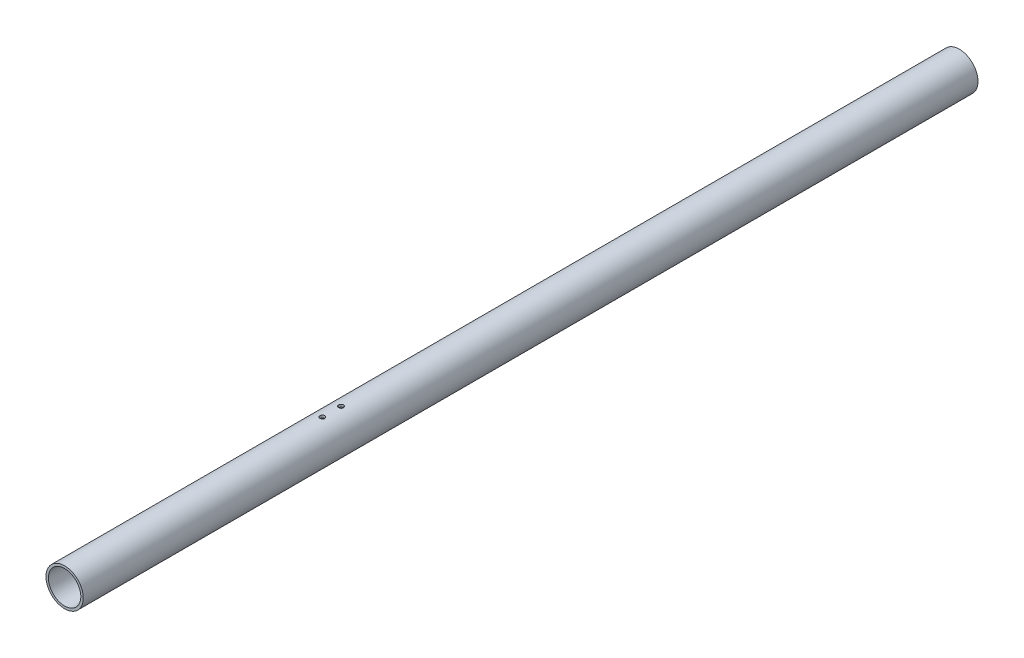
ISO-10303-21;
HEADER;
FILE_DESCRIPTION(('STEP AP214'),'2;1');
FILE_NAME('part.step','',(''),(''),'','','');
FILE_SCHEMA(('AUTOMOTIVE_DESIGN { 1 0 10303 214 1 1 1 1 }'));
ENDSEC;
DATA;
#1=APPLICATION_CONTEXT('core data for automotive mechanical design processes');
#2=APPLICATION_PROTOCOL_DEFINITION('international standard','automotive_design',2000,#1);
#3=PRODUCT_CONTEXT('',#1,'mechanical');
#4=PRODUCT('Part','Part','',(#3));
#5=PRODUCT_RELATED_PRODUCT_CATEGORY('part','',(#4));
#6=PRODUCT_DEFINITION_FORMATION('','',#4);
#7=PRODUCT_DEFINITION_CONTEXT('part definition',#1,'design');
#8=PRODUCT_DEFINITION('design','',#6,#7);
#9=PRODUCT_DEFINITION_SHAPE('','',#8);
#10=(LENGTH_UNIT() NAMED_UNIT(*) SI_UNIT(.MILLI.,.METRE.));
#11=(NAMED_UNIT(*) PLANE_ANGLE_UNIT() SI_UNIT($,.RADIAN.));
#12=(NAMED_UNIT(*) SI_UNIT($,.STERADIAN.) SOLID_ANGLE_UNIT());
#13=UNCERTAINTY_MEASURE_WITH_UNIT(LENGTH_MEASURE(1.E-05),#10,'distance_accuracy_value','');
#14=(GEOMETRIC_REPRESENTATION_CONTEXT(3) GLOBAL_UNCERTAINTY_ASSIGNED_CONTEXT((#13)) GLOBAL_UNIT_ASSIGNED_CONTEXT((#10,
#11,#12)) REPRESENTATION_CONTEXT('',''));
#15=CARTESIAN_POINT('',(0.,0.,0.));
#16=DIRECTION('',(0.,0.,1.));
#17=DIRECTION('',(1.,0.,0.));
#18=AXIS2_PLACEMENT_3D('',#15,#16,#17);
#19=CARTESIAN_POINT('',(0.,0.,0.));
#20=DIRECTION('',(0.,0.,1.));
#21=DIRECTION('',(1.,0.,0.));
#22=AXIS2_PLACEMENT_3D('',#19,#20,#21);
#23=PLANE('',#22);
#24=CARTESIAN_POINT('',(0.,0.,0.));
#25=DIRECTION('',(0.,0.,1.));
#26=DIRECTION('',(1.,0.,0.));
#27=AXIS2_PLACEMENT_3D('',#24,#25,#26);
#28=CIRCLE('',#27,12.7);
#29=CARTESIAN_POINT('',(12.7,0.,0.));
#30=VERTEX_POINT('',#29);
#31=EDGE_CURVE('E37',#30,#30,#28,.T.);
#32=ORIENTED_EDGE('',*,*,#31,.F.);
#33=EDGE_LOOP('',(#32));
#34=FACE_BOUND('',#33,.T.);
#35=CARTESIAN_POINT('',(0.,0.,0.));
#36=DIRECTION('',(0.,0.,1.));
#37=DIRECTION('',(1.,0.,0.));
#38=AXIS2_PLACEMENT_3D('',#35,#36,#37);
#39=CIRCLE('',#38,11.0998);
#40=CARTESIAN_POINT('',(-11.0998,0.,0.));
#41=VERTEX_POINT('',#40);
#42=EDGE_CURVE('E183',#41,#41,#39,.T.);
#43=ORIENTED_EDGE('',*,*,#42,.T.);
#44=EDGE_LOOP('',(#43));
#45=FACE_BOUND('',#44,.T.);
#46=ADVANCED_FACE('F33',(#34,#45),#23,.F.);
#47=CARTESIAN_POINT('',(0.,0.,609.6));
#48=DIRECTION('',(0.,0.,1.));
#49=DIRECTION('',(1.,0.,0.));
#50=AXIS2_PLACEMENT_3D('',#47,#48,#49);
#51=PLANE('',#50);
#52=CARTESIAN_POINT('',(0.,0.,609.6));
#53=DIRECTION('',(0.,0.,1.));
#54=DIRECTION('',(1.,0.,0.));
#55=AXIS2_PLACEMENT_3D('',#52,#53,#54);
#56=CIRCLE('',#55,12.7);
#57=CARTESIAN_POINT('',(12.7,0.,609.6));
#58=VERTEX_POINT('',#57);
#59=EDGE_CURVE('E11',#58,#58,#56,.T.);
#60=ORIENTED_EDGE('',*,*,#59,.T.);
#61=EDGE_LOOP('',(#60));
#62=FACE_BOUND('',#61,.T.);
#63=CARTESIAN_POINT('',(0.,0.,609.6));
#64=DIRECTION('',(0.,0.,1.));
#65=DIRECTION('',(1.,0.,0.));
#66=AXIS2_PLACEMENT_3D('',#63,#64,#65);
#67=CIRCLE('',#66,11.049);
#68=CARTESIAN_POINT('',(11.049,0.,609.6));
#69=VERTEX_POINT('',#68);
#70=EDGE_CURVE('E187',#69,#69,#67,.T.);
#71=ORIENTED_EDGE('',*,*,#70,.F.);
#72=EDGE_LOOP('',(#71));
#73=FACE_BOUND('',#72,.T.);
#74=ADVANCED_FACE('F141',(#62,#73),#51,.T.);
#75=CARTESIAN_POINT('',(0.,0.,609.6));
#76=DIRECTION('',(0.,0.,-1.));
#77=DIRECTION('',(-1.,0.,0.));
#78=AXIS2_PLACEMENT_3D('',#75,#76,#77);
#79=CYLINDRICAL_SURFACE('',#78,12.7);
#80=CARTESIAN_POINT('',(0.,0.,228.6));
#81=DIRECTION('',(0.,0.,-1.));
#82=DIRECTION('',(-1.,0.,0.));
#83=AXIS2_PLACEMENT_3D('',#80,#81,#82);
#84=CIRCLE('',#83,12.7);
#85=CARTESIAN_POINT('',(-7.62,-10.16,228.6));
#86=VERTEX_POINT('',#85);
#87=CARTESIAN_POINT('',(7.62,-10.16,228.6));
#88=VERTEX_POINT('',#87);
#89=EDGE_CURVE('E92',#86,#88,#84,.F.);
#90=ORIENTED_EDGE('',*,*,#89,.F.);
#91=DIRECTION('',(0.,0.,-1.));
#92=VECTOR('',#91,1.);
#93=CARTESIAN_POINT('',(-7.6200000000004,-10.1599999999997,609.6));
#94=LINE('',#93,#92);
#95=CARTESIAN_POINT('',(-7.62000000000007,-10.1599999999999,292.1));
#96=VERTEX_POINT('',#95);
#97=EDGE_CURVE('E48',#96,#86,#94,.T.);
#98=ORIENTED_EDGE('',*,*,#97,.F.);
#99=CARTESIAN_POINT('',(0.,0.,292.1));
#100=DIRECTION('',(0.,0.,1.));
#101=DIRECTION('',(1.,0.,0.));
#102=AXIS2_PLACEMENT_3D('',#99,#100,#101);
#103=CIRCLE('',#102,12.7);
#104=CARTESIAN_POINT('',(7.62,-10.16,292.1));
#105=VERTEX_POINT('',#104);
#106=EDGE_CURVE('E84',#105,#96,#103,.F.);
#107=ORIENTED_EDGE('',*,*,#106,.F.);
#108=DIRECTION('',(0.,0.,-1.));
#109=VECTOR('',#108,1.);
#110=CARTESIAN_POINT('',(7.62,-10.16,609.6));
#111=LINE('',#110,#109);
#112=EDGE_CURVE('E91',#88,#105,#111,.F.);
#113=ORIENTED_EDGE('',*,*,#112,.F.);
#114=EDGE_LOOP('',(#90,#98,#107,#113));
#115=FACE_BOUND('',#114,.T.);
#116=CARTESIAN_POINT('',(0.,12.7,422.9735));
#117=CARTESIAN_POINT('',(0.0923197389102192,12.699998670555,422.973496097362));
#118=CARTESIAN_POINT('',(0.184696404283785,12.6989827379539,422.965730456101));
#119=CARTESIAN_POINT('',(0.366877064574824,12.6950277124567,422.934875591195));
#120=CARTESIAN_POINT('',(0.456678307147007,12.69208663666,422.911770567612));
#121=CARTESIAN_POINT('',(0.631044478997818,12.6846125013601,422.850931013443));
#122=CARTESIAN_POINT('',(0.71561296750879,12.6800805382702,422.813206556474));
#123=CARTESIAN_POINT('',(0.877203333005435,12.6699280658685,422.724221529481));
#124=CARTESIAN_POINT('',(0.95422645551076,12.6643077366718,422.672963198683));
#125=CARTESIAN_POINT('',(1.09901230685169,12.6525682717349,422.558040439715));
#126=CARTESIAN_POINT('',(1.16672378827753,12.646446650032,422.494311694668));
#127=CARTESIAN_POINT('',(1.29052276323825,12.6344144783795,422.356395308793));
#128=CARTESIAN_POINT('',(1.34660965089903,12.6285039394449,422.282207123159));
#129=CARTESIAN_POINT('',(1.44575992266994,12.6175387656263,422.125142522635));
#130=CARTESIAN_POINT('',(1.48877498571276,12.6124873360828,422.042235360999));
#131=CARTESIAN_POINT('',(1.56025194281621,12.6038453631787,421.870297198417));
#132=CARTESIAN_POINT('',(1.58871443298445,12.6002547599804,421.781266448478));
#133=CARTESIAN_POINT('',(1.6301218914794,12.5949648794456,421.600141722264));
#134=CARTESIAN_POINT('',(1.64315364088517,12.5932550288299,421.508067899499));
#135=CARTESIAN_POINT('',(1.6535982828231,12.5918879481861,421.323025500672));
#136=CARTESIAN_POINT('',(1.65101185304121,12.5922306290968,421.230056963607));
#137=CARTESIAN_POINT('',(1.63036473262749,12.5949202170782,421.046470483413));
#138=CARTESIAN_POINT('',(1.61239983006777,12.5972547173845,420.955841559785));
#139=CARTESIAN_POINT('',(1.5616552661661,12.6036455494562,420.778895705563));
#140=CARTESIAN_POINT('',(1.52887528233767,12.6077019187022,420.692578868877));
#141=CARTESIAN_POINT('',(1.44932872425687,12.6170934394559,420.526410972526));
#142=CARTESIAN_POINT('',(1.40252072086991,12.6224323693691,420.446579967749));
#143=CARTESIAN_POINT('',(1.29627644281155,12.6337845657741,420.295869673024));
#144=CARTESIAN_POINT('',(1.23683954367999,12.6397978656044,420.224990826009));
#145=CARTESIAN_POINT('',(1.10649474856651,12.651876347101,420.093641003873));
#146=CARTESIAN_POINT('',(1.03550432626033,12.6579415802211,420.033251898208));
#147=CARTESIAN_POINT('',(0.88435125304852,12.6693984806316,419.92523390034));
#148=CARTESIAN_POINT('',(0.804188577945916,12.674790146145,419.8776050418));
#149=CARTESIAN_POINT('',(0.636901934004409,12.6842961570133,419.796458719039));
#150=CARTESIAN_POINT('',(0.549775342244202,12.6884100182125,419.762946601894));
#151=CARTESIAN_POINT('',(0.371066097867532,12.6948925849565,419.711051183935));
#152=CARTESIAN_POINT('',(0.279483671250365,12.6972613789126,419.692667116675));
#153=CARTESIAN_POINT('',(0.0951700862970201,12.6999753807479,419.671656274947));
#154=CARTESIAN_POINT('',(0.00245198427542727,12.7003350661182,419.668916763726));
#155=CARTESIAN_POINT('',(-0.182121247423533,12.6990294723088,419.678974964486));
#156=CARTESIAN_POINT('',(-0.273976396965607,12.6973642398574,419.69177231793));
#157=CARTESIAN_POINT('',(-0.453882000959678,12.6922049218535,419.732447302073));
#158=CARTESIAN_POINT('',(-0.541944861810711,12.688717383211,419.760270960436));
#159=CARTESIAN_POINT('',(-0.712154833680156,12.6803037637704,419.830152480721));
#160=CARTESIAN_POINT('',(-0.794301728897151,12.6753776305285,419.872210861576));
#161=CARTESIAN_POINT('',(-0.950849975256883,12.6645995954477,419.969639161872));
#162=CARTESIAN_POINT('',(-1.02520575427607,12.6587427018949,420.025081744998));
#163=CARTESIAN_POINT('',(-1.1635968991479,12.6467733558605,420.147602145678));
#164=CARTESIAN_POINT('',(-1.22763182032437,12.6406608923818,420.214680464301));
#165=CARTESIAN_POINT('',(-1.34396543320204,12.6288244172772,420.359065837333));
#166=CARTESIAN_POINT('',(-1.39618923353465,12.6231030366158,420.436433480283));
#167=CARTESIAN_POINT('',(-1.48690019485771,12.6127404277303,420.598908373427));
#168=CARTESIAN_POINT('',(-1.52538764994919,12.608099176381,420.684015457868));
#169=CARTESIAN_POINT('',(-1.58741311039977,12.6004404757973,420.859315128519));
#170=CARTESIAN_POINT('',(-1.61099281517193,12.5974185008299,420.949492754208));
#171=CARTESIAN_POINT('',(-1.64266745230584,12.5933277144336,421.132569537041));
#172=CARTESIAN_POINT('',(-1.65076316878595,12.5922588041006,421.225468556129));
#173=CARTESIAN_POINT('',(-1.65122484005353,12.5921982121051,421.410605763984));
#174=CARTESIAN_POINT('',(-1.64370846510461,12.5931909912238,421.502843676243));
#175=CARTESIAN_POINT('',(-1.61340904947854,12.5971084415124,421.684733042938));
#176=CARTESIAN_POINT('',(-1.59062601143109,12.6000331123496,421.774384497819));
#177=CARTESIAN_POINT('',(-1.5304777090815,12.6074798861937,421.948537376334));
#178=CARTESIAN_POINT('',(-1.49311859500641,12.6120013153884,422.033040954699));
#179=CARTESIAN_POINT('',(-1.40489019316675,12.6221332066385,422.194598948657));
#180=CARTESIAN_POINT('',(-1.35402068173348,12.627743686723,422.271653240896));
#181=CARTESIAN_POINT('',(-1.23978050398631,12.6394721362881,422.416726276566));
#182=CARTESIAN_POINT('',(-1.1763222170601,12.645593477885,422.484675754525));
#183=CARTESIAN_POINT('',(-1.03888941066722,12.65762444869,422.609005818153));
#184=CARTESIAN_POINT('',(-0.964912422770739,12.6635340277949,422.665383680693));
#185=CARTESIAN_POINT('',(-0.808191479513471,12.6745026486185,422.765169535355));
#186=CARTESIAN_POINT('',(-0.725412761906104,12.6795580970474,422.808523302495));
#187=CARTESIAN_POINT('',(-0.553728785901388,12.68821273462,422.880651615353));
#188=CARTESIAN_POINT('',(-0.464830244997485,12.6918134916074,422.909441865885));
#189=CARTESIAN_POINT('',(-0.312902165480971,12.6962935232424,422.944800729471));
#190=CARTESIAN_POINT('',(-0.250827222032526,12.697676613206,422.955547309626));
#191=CARTESIAN_POINT('',(-0.125843666206232,12.6995303009823,422.969898245776));
#192=CARTESIAN_POINT('',(-0.0629350606826986,12.7000009062927,422.973502660457));
#193=CARTESIAN_POINT('',(0.,12.7,422.9735));
#194=B_SPLINE_CURVE_WITH_KNOTS('',3,(#116,#117,#118,#119,#120,#121,#122,#123,#124,#125,#126,
#127,#128,#129,#130,#131,#132,#133,#134,#135,#136,#137,#138,#139,#140,#141,#142,#143,#144,#145,
#146,#147,#148,#149,#150,#151,#152,#153,#154,#155,#156,#157,#158,#159,#160,#161,#162,#163,#164,
#165,#166,#167,#168,#169,#170,#171,#172,#173,#174,#175,#176,#177,#178,#179,#180,#181,#182,#183,
#184,#185,#186,#187,#188,#189,#190,#191,#192,#193),.UNSPECIFIED.,.T.,.F.,(4,2,2,2,2,2,2,2,2,2,2,
2,2,2,2,2,2,2,2,2,2,2,2,2,2,2,2,2,2,2,2,2,2,2,2,2,2,2,4),(0.,0.276729318665787,0.55374411844029,
0.830568377778716,1.10734686424083,1.38559237951135,1.66385239330003,1.94312884457032,
2.2223938551036,2.50008073026608,2.77775555644762,3.05371330716762,3.3296770650724,
3.60646399927714,3.88326462293289,4.16213699143935,4.44101009564505,4.71998873537377,
4.99895324006721,5.27590492779546,5.552850224545,5.8288073259234,6.10477448851659,
6.38227499086469,6.65978744618144,6.93901306372936,7.21823270257891,7.49666782217781,
7.77508884128356,8.05141898360028,8.32774907831875,8.60396270423625,8.8801809032389,
9.15839372676363,9.43667194674197,9.71609319569024,9.99521248018732,10.1838624891018,
10.3725109479092),.UNSPECIFIED.);
#195=CARTESIAN_POINT('',(0.,12.7,422.9735));
#196=VERTEX_POINT('',#195);
#197=EDGE_CURVE('E104',#196,#196,#194,.T.);
#198=ORIENTED_EDGE('',*,*,#197,.F.);
#199=EDGE_LOOP('',(#198));
#200=FACE_BOUND('',#199,.T.);
#201=CARTESIAN_POINT('',(0.,12.7,435.6735));
#202=CARTESIAN_POINT('',(0.0923197389102192,12.699998670555,435.673496097362));
#203=CARTESIAN_POINT('',(0.184696404283786,12.6989827379539,435.665730456101));
#204=CARTESIAN_POINT('',(0.366877064574823,12.6950277124567,435.634875591195));
#205=CARTESIAN_POINT('',(0.456678307147006,12.69208663666,435.611770567612));
#206=CARTESIAN_POINT('',(0.631044478997826,12.6846125013601,435.550931013443));
#207=CARTESIAN_POINT('',(0.715612967508808,12.6800805382702,435.513206556474));
#208=CARTESIAN_POINT('',(0.877203333005451,12.6699280658685,435.424221529481));
#209=CARTESIAN_POINT('',(0.954226455510767,12.6643077366718,435.372963198683));
#210=CARTESIAN_POINT('',(1.09901230685169,12.6525682717349,435.258040439715));
#211=CARTESIAN_POINT('',(1.16672378827753,12.646446650032,435.194311694668));
#212=CARTESIAN_POINT('',(1.29052276323825,12.6344144783795,435.056395308793));
#213=CARTESIAN_POINT('',(1.34660965089903,12.6285039394449,434.982207123159));
#214=CARTESIAN_POINT('',(1.44575992266993,12.6175387656263,434.825142522635));
#215=CARTESIAN_POINT('',(1.48877498571275,12.6124873360828,434.742235360999));
#216=CARTESIAN_POINT('',(1.5602519428162,12.6038453631787,434.570297198417));
#217=CARTESIAN_POINT('',(1.58871443298445,12.6002547599804,434.481266448478));
#218=CARTESIAN_POINT('',(1.6301218914794,12.5949648794456,434.300141722264));
#219=CARTESIAN_POINT('',(1.64315364088518,12.5932550288299,434.208067899499));
#220=CARTESIAN_POINT('',(1.6535982828231,12.5918879481861,434.023025500672));
#221=CARTESIAN_POINT('',(1.65101185304121,12.5922306290968,433.930056963607));
#222=CARTESIAN_POINT('',(1.63036473262749,12.5949202170782,433.746470483413));
#223=CARTESIAN_POINT('',(1.61239983006777,12.5972547173845,433.655841559785));
#224=CARTESIAN_POINT('',(1.5616552661661,12.6036455494562,433.478895705563));
#225=CARTESIAN_POINT('',(1.52887528233767,12.6077019187022,433.392578868877));
#226=CARTESIAN_POINT('',(1.44932872425687,12.6170934394559,433.226410972526));
#227=CARTESIAN_POINT('',(1.40252072086992,12.6224323693691,433.146579967749));
#228=CARTESIAN_POINT('',(1.29627644281155,12.6337845657741,432.995869673024));
#229=CARTESIAN_POINT('',(1.23683954367998,12.6397978656044,432.924990826009));
#230=CARTESIAN_POINT('',(1.1064947485665,12.651876347101,432.793641003873));
#231=CARTESIAN_POINT('',(1.03550432626032,12.6579415802211,432.733251898208));
#232=CARTESIAN_POINT('',(0.884351253048507,12.6693984806316,432.62523390034));
#233=CARTESIAN_POINT('',(0.804188577945905,12.674790146145,432.5776050418));
#234=CARTESIAN_POINT('',(0.636901934004405,12.6842961570133,432.496458719039));
#235=CARTESIAN_POINT('',(0.549775342244201,12.6884100182125,432.462946601894));
#236=CARTESIAN_POINT('',(0.371066097867533,12.6948925849565,432.411051183935));
#237=CARTESIAN_POINT('',(0.279483671250365,12.6972613789126,432.392667116675));
#238=CARTESIAN_POINT('',(0.0951700862970208,12.6999753807479,432.371656274947));
#239=CARTESIAN_POINT('',(0.00245198427542915,12.7003350661182,432.368916763726));
#240=CARTESIAN_POINT('',(-0.182121247423531,12.6990294723088,432.378974964486));
#241=CARTESIAN_POINT('',(-0.273976396965606,12.6973642398574,432.39177231793));
#242=CARTESIAN_POINT('',(-0.453882000959678,12.6922049218535,432.432447302073));
#243=CARTESIAN_POINT('',(-0.541944861810711,12.688717383211,432.460270960436));
#244=CARTESIAN_POINT('',(-0.712154833680156,12.6803037637704,432.530152480721));
#245=CARTESIAN_POINT('',(-0.794301728897151,12.6753776305285,432.572210861576));
#246=CARTESIAN_POINT('',(-0.950849975256883,12.6645995954477,432.669639161872));
#247=CARTESIAN_POINT('',(-1.02520575427607,12.6587427018949,432.725081744998));
#248=CARTESIAN_POINT('',(-1.1635968991479,12.6467733558605,432.847602145678));
#249=CARTESIAN_POINT('',(-1.22763182032437,12.6406608923818,432.914680464301));
#250=CARTESIAN_POINT('',(-1.34396543320204,12.6288244172772,433.059065837333));
#251=CARTESIAN_POINT('',(-1.39618923353465,12.6231030366158,433.136433480283));
#252=CARTESIAN_POINT('',(-1.48690019485771,12.6127404277303,433.298908373427));
#253=CARTESIAN_POINT('',(-1.52538764994918,12.608099176381,433.384015457868));
#254=CARTESIAN_POINT('',(-1.58741311039977,12.6004404757973,433.559315128519));
#255=CARTESIAN_POINT('',(-1.61099281517193,12.5974185008299,433.649492754208));
#256=CARTESIAN_POINT('',(-1.64266745230584,12.5933277144336,433.832569537041));
#257=CARTESIAN_POINT('',(-1.65076316878595,12.5922588041006,433.925468556129));
#258=CARTESIAN_POINT('',(-1.65122484005353,12.5921982121051,434.110605763984));
#259=CARTESIAN_POINT('',(-1.64370846510461,12.5931909912238,434.202843676243));
#260=CARTESIAN_POINT('',(-1.61340904947853,12.5971084415124,434.384733042938));
#261=CARTESIAN_POINT('',(-1.59062601143108,12.6000331123496,434.474384497819));
#262=CARTESIAN_POINT('',(-1.5304777090815,12.6074798861937,434.648537376334));
#263=CARTESIAN_POINT('',(-1.49311859500639,12.6120013153884,434.733040954699));
#264=CARTESIAN_POINT('',(-1.40489019316674,12.6221332066385,434.894598948657));
#265=CARTESIAN_POINT('',(-1.35402068173347,12.627743686723,434.971653240896));
#266=CARTESIAN_POINT('',(-1.2397805039863,12.6394721362881,435.116726276566));
#267=CARTESIAN_POINT('',(-1.17632221706008,12.645593477885,435.184675754525));
#268=CARTESIAN_POINT('',(-1.0388894106672,12.65762444869,435.309005818153));
#269=CARTESIAN_POINT('',(-0.964912422770729,12.6635340277949,435.365383680693));
#270=CARTESIAN_POINT('',(-0.808191479513474,12.6745026486185,435.465169535355));
#271=CARTESIAN_POINT('',(-0.725412761906105,12.6795580970474,435.508523302495));
#272=CARTESIAN_POINT('',(-0.553728785901388,12.68821273462,435.580651615353));
#273=CARTESIAN_POINT('',(-0.464830244997485,12.6918134916074,435.609441865885));
#274=CARTESIAN_POINT('',(-0.312902165480973,12.6962935232424,435.644800729471));
#275=CARTESIAN_POINT('',(-0.25082722203253,12.697676613206,435.655547309626));
#276=CARTESIAN_POINT('',(-0.125843666206236,12.6995303009823,435.669898245776));
#277=CARTESIAN_POINT('',(-0.0629350606827007,12.7000009062927,435.673502660457));
#278=CARTESIAN_POINT('',(0.,12.7,435.6735));
#279=B_SPLINE_CURVE_WITH_KNOTS('',3,(#201,#202,#203,#204,#205,#206,#207,#208,#209,#210,#211,
#212,#213,#214,#215,#216,#217,#218,#219,#220,#221,#222,#223,#224,#225,#226,#227,#228,#229,#230,
#231,#232,#233,#234,#235,#236,#237,#238,#239,#240,#241,#242,#243,#244,#245,#246,#247,#248,#249,
#250,#251,#252,#253,#254,#255,#256,#257,#258,#259,#260,#261,#262,#263,#264,#265,#266,#267,#268,
#269,#270,#271,#272,#273,#274,#275,#276,#277,#278),.UNSPECIFIED.,.T.,.F.,(4,2,2,2,2,2,2,2,2,2,2,
2,2,2,2,2,2,2,2,2,2,2,2,2,2,2,2,2,2,2,2,2,2,2,2,2,2,2,4),(0.,0.276729318665787,0.55374411844029,
0.830568377778737,1.10734686424083,1.38559237951136,1.66385239330003,1.94312884457027,
2.2223938551036,2.50008073026614,2.77775555644762,3.05371330716763,3.3296770650724,
3.60646399927715,3.88326462293289,4.16213699143941,4.44101009564506,4.71998873537377,
4.99895324006722,5.27590492779547,5.55285022454501,5.82880732592341,6.1047744885166,
6.38227499086469,6.65978744618144,6.93901306372937,7.21823270257892,7.49666782217781,
7.77508884128356,8.05141898360034,8.32774907831876,8.60396270423632,8.88018090323891,
9.15839372676366,9.43667194674197,9.71609319569025,9.99521248018732,10.1838624891018,
10.3725109479092),.UNSPECIFIED.);
#280=CARTESIAN_POINT('',(0.,12.7,435.6735));
#281=VERTEX_POINT('',#280);
#282=EDGE_CURVE('E170',#281,#281,#279,.T.);
#283=ORIENTED_EDGE('',*,*,#282,.F.);
#284=EDGE_LOOP('',(#283));
#285=FACE_BOUND('',#284,.T.);
#286=ORIENTED_EDGE('',*,*,#59,.F.);
#287=EDGE_LOOP('',(#286));
#288=FACE_BOUND('',#287,.T.);
#289=ORIENTED_EDGE('',*,*,#31,.T.);
#290=EDGE_LOOP('',(#289));
#291=FACE_BOUND('',#290,.T.);
#292=ADVANCED_FACE('F35',(#115,#200,#285,#288,#291),#79,.T.);
#293=CARTESIAN_POINT('',(0.,0.,609.6));
#294=DIRECTION('',(0.,0.,-1.));
#295=DIRECTION('',(-1.,0.,0.));
#296=AXIS2_PLACEMENT_3D('',#293,#294,#295);
#297=CYLINDRICAL_SURFACE('',#296,11.049);
#298=DIRECTION('',(0.,0.,-1.));
#299=VECTOR('',#298,1.);
#300=CARTESIAN_POINT('',(-7.6200000000004,-8.00099999999961,609.6));
#301=LINE('',#300,#299);
#302=CARTESIAN_POINT('',(-7.62000000000007,-8.00099999999994,292.1));
#303=VERTEX_POINT('',#302);
#304=CARTESIAN_POINT('',(-7.62,-8.001,228.6));
#305=VERTEX_POINT('',#304);
#306=EDGE_CURVE('E77',#303,#305,#301,.T.);
#307=ORIENTED_EDGE('',*,*,#306,.T.);
#308=CARTESIAN_POINT('',(0.,0.,228.6));
#309=DIRECTION('',(0.,0.,-1.));
#310=DIRECTION('',(-1.,0.,0.));
#311=AXIS2_PLACEMENT_3D('',#308,#309,#310);
#312=CIRCLE('',#311,11.049);
#313=CARTESIAN_POINT('',(7.62,-8.001,228.6));
#314=VERTEX_POINT('',#313);
#315=EDGE_CURVE('E98',#305,#314,#312,.F.);
#316=ORIENTED_EDGE('',*,*,#315,.T.);
#317=DIRECTION('',(0.,0.,-1.));
#318=VECTOR('',#317,1.);
#319=CARTESIAN_POINT('',(7.62,-8.001,609.6));
#320=LINE('',#319,#318);
#321=CARTESIAN_POINT('',(7.62,-8.001,292.1));
#322=VERTEX_POINT('',#321);
#323=EDGE_CURVE('E80',#314,#322,#320,.F.);
#324=ORIENTED_EDGE('',*,*,#323,.T.);
#325=CARTESIAN_POINT('',(0.,0.,292.1));
#326=DIRECTION('',(0.,0.,1.));
#327=DIRECTION('',(1.,0.,0.));
#328=AXIS2_PLACEMENT_3D('',#325,#326,#327);
#329=CIRCLE('',#328,11.049);
#330=EDGE_CURVE('E81',#322,#303,#329,.F.);
#331=ORIENTED_EDGE('',*,*,#330,.T.);
#332=EDGE_LOOP('',(#307,#316,#324,#331));
#333=FACE_BOUND('',#332,.T.);
#334=CARTESIAN_POINT('',(0.,11.049,422.9735));
#335=CARTESIAN_POINT('',(0.0921867408347738,11.0489985264443,422.973496195148));
#336=CARTESIAN_POINT('',(0.184427075611157,11.0478341738615,422.965752800569));
#337=CARTESIAN_POINT('',(0.366329778537115,11.0433013997287,422.934991494046));
#338=CARTESIAN_POINT('',(0.455989542933329,11.0399308282826,422.911958682699));
#339=CARTESIAN_POINT('',(0.630072263334059,11.0313644158597,422.851321895063));
#340=CARTESIAN_POINT('',(0.714499111142204,11.0261699509797,422.813728901987));
#341=CARTESIAN_POINT('',(0.875833276162068,11.0145298313659,422.725065647992));
#342=CARTESIAN_POINT('',(0.952741641746628,11.0080843514482,422.673997269756));
#343=CARTESIAN_POINT('',(1.09746507465817,10.9946031387203,422.559410893431));
#344=CARTESIAN_POINT('',(1.16521339312233,10.9875636230886,422.495809027202));
#345=CARTESIAN_POINT('',(1.28911773554911,10.9737173668496,422.358141563215));
#346=CARTESIAN_POINT('',(1.34527309473488,10.9669106396098,422.284075365809));
#347=CARTESIAN_POINT('',(1.44465703728666,10.9542639185612,422.127133584034));
#348=CARTESIAN_POINT('',(1.48782108895829,10.9484288130761,422.044216706659));
#349=CARTESIAN_POINT('',(1.55958475788718,10.938437605294,421.872208322488));
#350=CARTESIAN_POINT('',(1.5881851628144,10.9342814121962,421.783117149922));
#351=CARTESIAN_POINT('',(1.62980248929794,10.9281557673011,421.601990918019));
#352=CARTESIAN_POINT('',(1.64293364781316,10.9261702931742,421.509982658635));
#353=CARTESIAN_POINT('',(1.65359362115879,10.9245622342782,421.325048825681));
#354=CARTESIAN_POINT('',(1.65112332507143,10.9249395148625,421.232123304685));
#355=CARTESIAN_POINT('',(1.63074387900013,10.9279996861036,421.048799479043));
#356=CARTESIAN_POINT('',(1.61296192647074,10.9306635807597,420.958386671562));
#357=CARTESIAN_POINT('',(1.56266303036634,10.9379671524862,420.781842565452));
#358=CARTESIAN_POINT('',(1.53014567287196,10.942606885058,420.69571138717));
#359=CARTESIAN_POINT('',(1.45116661119987,10.9533603469683,420.52978827947));
#360=CARTESIAN_POINT('',(1.40465099483901,10.9594797568254,420.450022395376));
#361=CARTESIAN_POINT('',(1.2990342224597,10.9724989557903,420.299380008637));
#362=CARTESIAN_POINT('',(1.2399322466486,10.9793987957164,420.228504085503));
#363=CARTESIAN_POINT('',(1.11012207051023,10.9932853581079,420.096916313357));
#364=CARTESIAN_POINT('',(1.03930450328254,11.000272263224,420.036312321128));
#365=CARTESIAN_POINT('',(0.888446241782213,11.0134820978135,419.927833138822));
#366=CARTESIAN_POINT('',(0.808405507680222,11.0197050239876,419.879958003715));
#367=CARTESIAN_POINT('',(0.641279741572268,11.0306921758495,419.798290122575));
#368=CARTESIAN_POINT('',(0.554190602148928,11.0354555431372,419.764505659389));
#369=CARTESIAN_POINT('',(0.375487839795124,11.0429796821412,419.712071705487));
#370=CARTESIAN_POINT('',(0.283874520816669,11.0457405881957,419.693421199476));
#371=CARTESIAN_POINT('',(0.0996548896570795,11.0489309409767,419.671927909776));
#372=CARTESIAN_POINT('',(0.00706624341411248,11.0493822577031,419.668936837268));
#373=CARTESIAN_POINT('',(-0.177290517802057,11.0479621007586,419.678453771606));
#374=CARTESIAN_POINT('',(-0.269058657889702,11.0460906984294,419.690961302417));
#375=CARTESIAN_POINT('',(-0.448720566225813,11.0402489058873,419.730997095062));
#376=CARTESIAN_POINT('',(-0.53663078136853,11.0362886086583,419.758453149985));
#377=CARTESIAN_POINT('',(-0.706600066589224,11.0267116646719,419.82753049524));
#378=CARTESIAN_POINT('',(-0.788658863490232,11.0210949406459,419.869152446391));
#379=CARTESIAN_POINT('',(-0.945248276267963,11.0087750196746,419.965728255408));
#380=CARTESIAN_POINT('',(-1.01972024423446,11.0020642692415,420.020776224573));
#381=CARTESIAN_POINT('',(-1.15842176671595,10.9883268456266,420.142510379356));
#382=CARTESIAN_POINT('',(-1.2226507303511,10.9813001542493,420.209197235913));
#383=CARTESIAN_POINT('',(-1.33958225509896,10.9676535000577,420.352976152771));
#384=CARTESIAN_POINT('',(-1.39218543940398,10.9610373673707,420.430149452364));
#385=CARTESIAN_POINT('',(-1.4836815408417,10.9490286553636,420.592323779914));
#386=CARTESIAN_POINT('',(-1.52257482617229,10.9436360431855,420.677324597577));
#387=CARTESIAN_POINT('',(-1.58539290146262,10.934712627744,420.852444163648));
#388=CARTESIAN_POINT('',(-1.60937008028394,10.9311753151828,420.942543773065));
#389=CARTESIAN_POINT('',(-1.6418421049183,10.926345663795,421.125547805285));
#390=CARTESIAN_POINT('',(-1.65033801102191,10.9250531712241,421.218452035561));
#391=CARTESIAN_POINT('',(-1.65158124252762,10.9248652099036,421.403437625353));
#392=CARTESIAN_POINT('',(-1.64448481908965,10.9259459587731,421.495517948685));
#393=CARTESIAN_POINT('',(-1.61507957251896,10.9303310341867,421.67715996156));
#394=CARTESIAN_POINT('',(-1.59277077302734,10.9336353572753,421.766721655018));
#395=CARTESIAN_POINT('',(-1.53362913545352,10.9420869764681,421.940741339965));
#396=CARTESIAN_POINT('',(-1.49680713492567,10.9472328971189,422.025203085631));
#397=CARTESIAN_POINT('',(-1.40969988036356,10.9587895848657,422.186775207181));
#398=CARTESIAN_POINT('',(-1.35941417749241,10.9652003941271,422.26388533787));
#399=CARTESIAN_POINT('',(-1.24623896598934,10.9786410156218,422.409359337662));
#400=CARTESIAN_POINT('',(-1.1832337131216,10.9856761531194,422.477632678862));
#401=CARTESIAN_POINT('',(-1.04665245843925,10.9995282274943,422.602693102616));
#402=CARTESIAN_POINT('',(-0.973074002249757,11.0063451132579,422.659477510835));
#403=CARTESIAN_POINT('',(-0.816962610155769,11.0190350889472,422.760224853067));
#404=CARTESIAN_POINT('',(-0.734382979244312,11.0249028228952,422.804116093879));
#405=CARTESIAN_POINT('',(-0.562975306287361,11.034980801987,422.877339983046));
#406=CARTESIAN_POINT('',(-0.474153853364054,11.0391927649459,422.906687728146));
#407=CARTESIAN_POINT('',(-0.320777095497283,11.0445218508612,422.943324589646));
#408=CARTESIAN_POINT('',(-0.257169048439705,11.0461925430834,422.954623100271));
#409=CARTESIAN_POINT('',(-0.129049415791971,11.0484321266871,422.96971209118));
#410=CARTESIAN_POINT('',(-0.0645378413104611,11.0490010316028,422.973502663691));
#411=CARTESIAN_POINT('',(0.,11.049,422.9735));
#412=B_SPLINE_CURVE_WITH_KNOTS('',3,(#334,#335,#336,#337,#338,#339,#340,#341,#342,#343,#344,
#345,#346,#347,#348,#349,#350,#351,#352,#353,#354,#355,#356,#357,#358,#359,#360,#361,#362,#363,
#364,#365,#366,#367,#368,#369,#370,#371,#372,#373,#374,#375,#376,#377,#378,#379,#380,#381,#382,
#383,#384,#385,#386,#387,#388,#389,#390,#391,#392,#393,#394,#395,#396,#397,#398,#399,#400,#401,
#402,#403,#404,#405,#406,#407,#408,#409,#410,#411),.UNSPECIFIED.,.T.,.F.,(4,2,2,2,2,2,2,2,2,2,2,
2,2,2,2,2,2,2,2,2,2,2,2,2,2,2,2,2,2,2,2,2,2,2,2,2,2,2,4),(0.,0.276324396462033,
0.552918464696098,0.829304294202654,1.10565152949229,1.38391490622181,1.6621942350215,
1.9418338741253,2.22145838740615,2.49900472681968,2.77653524980465,3.05178226373619,
3.32703700987,3.60336572842406,3.87971245072057,4.1588018347509,4.43789242404699,
4.71714683928055,4.99638251857108,5.27296909688309,5.54954718011849,5.82480099074694,
6.10006764336276,6.37732225351229,6.65459285164165,6.93414900239683,7.21369764472114,
7.49225881982589,7.77080091595072,8.0465644757226,8.32232760693933,8.59788520438361,
8.87345198918323,9.15164958648452,9.42991186688032,9.70969335825127,9.98918381340025,
10.1826346172267,10.3760830447076),.UNSPECIFIED.);
#413=CARTESIAN_POINT('',(0.,11.049,422.9735));
#414=VERTEX_POINT('',#413);
#415=EDGE_CURVE('E117',#414,#414,#412,.T.);
#416=ORIENTED_EDGE('',*,*,#415,.T.);
#417=EDGE_LOOP('',(#416));
#418=FACE_BOUND('',#417,.T.);
#419=CARTESIAN_POINT('',(0.,11.049,435.6735));
#420=CARTESIAN_POINT('',(0.0921867408347707,11.0489985264443,435.673496195147));
#421=CARTESIAN_POINT('',(0.184427075611151,11.0478341738615,435.665752800569));
#422=CARTESIAN_POINT('',(0.366329778537109,11.0433013997287,435.634991494046));
#423=CARTESIAN_POINT('',(0.455989542933326,11.0399308282826,435.611958682699));
#424=CARTESIAN_POINT('',(0.63007226333406,11.0313644158597,435.551321895063));
#425=CARTESIAN_POINT('',(0.714499111142205,11.0261699509797,435.513728901987));
#426=CARTESIAN_POINT('',(0.875833276162067,11.0145298313659,435.425065647992));
#427=CARTESIAN_POINT('',(0.952741641746624,11.0080843514482,435.373997269756));
#428=CARTESIAN_POINT('',(1.09746507465818,10.9946031387203,435.259410893431));
#429=CARTESIAN_POINT('',(1.16521339312236,10.9875636230886,435.195809027202));
#430=CARTESIAN_POINT('',(1.28911773554913,10.9737173668496,435.058141563215));
#431=CARTESIAN_POINT('',(1.34527309473488,10.9669106396098,434.984075365809));
#432=CARTESIAN_POINT('',(1.44465703728666,10.9542639185612,434.827133584034));
#433=CARTESIAN_POINT('',(1.48782108895831,10.9484288130761,434.744216706659));
#434=CARTESIAN_POINT('',(1.5595847578872,10.938437605294,434.572208322488));
#435=CARTESIAN_POINT('',(1.58818516281441,10.9342814121962,434.483117149922));
#436=CARTESIAN_POINT('',(1.62980248929794,10.9281557673011,434.301990918019));
#437=CARTESIAN_POINT('',(1.64293364781316,10.9261702931742,434.209982658635));
#438=CARTESIAN_POINT('',(1.65359362115879,10.9245622342782,434.025048825681));
#439=CARTESIAN_POINT('',(1.65112332507142,10.9249395148625,433.932123304685));
#440=CARTESIAN_POINT('',(1.63074387900012,10.9279996861036,433.748799479043));
#441=CARTESIAN_POINT('',(1.61296192647074,10.9306635807597,433.658386671562));
#442=CARTESIAN_POINT('',(1.56266303036633,10.9379671524862,433.481842565452));
#443=CARTESIAN_POINT('',(1.53014567287196,10.942606885058,433.39571138717));
#444=CARTESIAN_POINT('',(1.45116661119987,10.9533603469683,433.22978827947));
#445=CARTESIAN_POINT('',(1.40465099483899,10.9594797568254,433.150022395376));
#446=CARTESIAN_POINT('',(1.29903422245968,10.9724989557903,432.999380008637));
#447=CARTESIAN_POINT('',(1.2399322466486,10.9793987957164,432.928504085503));
#448=CARTESIAN_POINT('',(1.11012207051024,10.9932853581079,432.796916313357));
#449=CARTESIAN_POINT('',(1.03930450328255,11.000272263224,432.736312321128));
#450=CARTESIAN_POINT('',(0.888446241782225,11.0134820978135,432.627833138822));
#451=CARTESIAN_POINT('',(0.808405507680233,11.0197050239876,432.579958003715));
#452=CARTESIAN_POINT('',(0.641279741572268,11.0306921758495,432.498290122575));
#453=CARTESIAN_POINT('',(0.554190602148919,11.0354555431372,432.464505659389));
#454=CARTESIAN_POINT('',(0.375487839795112,11.0429796821412,432.412071705487));
#455=CARTESIAN_POINT('',(0.283874520816663,11.0457405881957,432.393421199476));
#456=CARTESIAN_POINT('',(0.0996548896570801,11.0489309409767,432.371927909776));
#457=CARTESIAN_POINT('',(0.00706624341411246,11.0493822577031,432.368936837268));
#458=CARTESIAN_POINT('',(-0.177290517802057,11.0479621007586,432.378453771606));
#459=CARTESIAN_POINT('',(-0.269058657889702,11.0460906984294,432.390961302417));
#460=CARTESIAN_POINT('',(-0.44872056622582,11.0402489058873,432.430997095062));
#461=CARTESIAN_POINT('',(-0.536630781368544,11.0362886086583,432.458453149985));
#462=CARTESIAN_POINT('',(-0.706600066589238,11.0267116646719,432.527530495239));
#463=CARTESIAN_POINT('',(-0.788658863490238,11.0210949406459,432.569152446391));
#464=CARTESIAN_POINT('',(-0.945248276267962,11.0087750196746,432.665728255408));
#465=CARTESIAN_POINT('',(-1.01972024423446,11.0020642692415,432.720776224573));
#466=CARTESIAN_POINT('',(-1.15842176671595,10.9883268456266,432.842510379356));
#467=CARTESIAN_POINT('',(-1.2226507303511,10.9813001542493,432.909197235913));
#468=CARTESIAN_POINT('',(-1.33958225509896,10.9676535000577,433.052976152771));
#469=CARTESIAN_POINT('',(-1.39218543940398,10.9610373673707,433.130149452364));
#470=CARTESIAN_POINT('',(-1.4836815408417,10.9490286553636,433.292323779914));
#471=CARTESIAN_POINT('',(-1.52257482617229,10.9436360431855,433.377324597576));
#472=CARTESIAN_POINT('',(-1.58539290146261,10.934712627744,433.552444163648));
#473=CARTESIAN_POINT('',(-1.60937008028393,10.9311753151828,433.642543773065));
#474=CARTESIAN_POINT('',(-1.64184210491829,10.926345663795,433.825547805285));
#475=CARTESIAN_POINT('',(-1.65033801102191,10.9250531712241,433.918452035561));
#476=CARTESIAN_POINT('',(-1.65158124252762,10.9248652099036,434.103437625353));
#477=CARTESIAN_POINT('',(-1.64448481908965,10.9259459587731,434.195517948685));
#478=CARTESIAN_POINT('',(-1.61507957251895,10.9303310341867,434.37715996156));
#479=CARTESIAN_POINT('',(-1.59277077302734,10.9336353572753,434.466721655018));
#480=CARTESIAN_POINT('',(-1.53362913545352,10.9420869764681,434.640741339965));
#481=CARTESIAN_POINT('',(-1.49680713492567,10.9472328971189,434.725203085631));
#482=CARTESIAN_POINT('',(-1.40969988036356,10.9587895848657,434.886775207181));
#483=CARTESIAN_POINT('',(-1.35941417749241,10.9652003941271,434.96388533787));
#484=CARTESIAN_POINT('',(-1.24623896598934,10.9786410156218,435.109359337662));
#485=CARTESIAN_POINT('',(-1.1832337131216,10.9856761531194,435.177632678862));
#486=CARTESIAN_POINT('',(-1.04665245843925,10.9995282274943,435.302693102616));
#487=CARTESIAN_POINT('',(-0.973074002249757,11.0063451132579,435.359477510835));
#488=CARTESIAN_POINT('',(-0.816962610155769,11.0190350889472,435.460224853067));
#489=CARTESIAN_POINT('',(-0.734382979244312,11.0249028228952,435.504116093879));
#490=CARTESIAN_POINT('',(-0.562975306287361,11.034980801987,435.577339983046));
#491=CARTESIAN_POINT('',(-0.474153853364054,11.0391927649459,435.606687728146));
#492=CARTESIAN_POINT('',(-0.320777095497283,11.0445218508612,435.643324589646));
#493=CARTESIAN_POINT('',(-0.257169048439705,11.0461925430834,435.654623100271));
#494=CARTESIAN_POINT('',(-0.129049415791971,11.0484321266871,435.66971209118));
#495=CARTESIAN_POINT('',(-0.0645378413104611,11.0490010316028,435.673502663691));
#496=CARTESIAN_POINT('',(0.,11.049,435.6735));
#497=B_SPLINE_CURVE_WITH_KNOTS('',3,(#419,#420,#421,#422,#423,#424,#425,#426,#427,#428,#429,
#430,#431,#432,#433,#434,#435,#436,#437,#438,#439,#440,#441,#442,#443,#444,#445,#446,#447,#448,
#449,#450,#451,#452,#453,#454,#455,#456,#457,#458,#459,#460,#461,#462,#463,#464,#465,#466,#467,
#468,#469,#470,#471,#472,#473,#474,#475,#476,#477,#478,#479,#480,#481,#482,#483,#484,#485,#486,
#487,#488,#489,#490,#491,#492,#493,#494,#495,#496),.UNSPECIFIED.,.T.,.F.,(4,2,2,2,2,2,2,2,2,2,2,
2,2,2,2,2,2,2,2,2,2,2,2,2,2,2,2,2,2,2,2,2,2,2,2,2,2,2,4),(0.,0.276324396462024,
0.552918464696097,0.829304294202654,1.10565152949229,1.38391490622183,1.6621942350215,
1.94183387412531,2.22145838740616,2.49900472681975,2.77653524980465,3.05178226373625,
3.32703700987001,3.60336572842408,3.87971245072057,4.15880183475084,4.43789242404699,
4.71714683928056,4.99638251857108,5.27296909688308,5.54954718011849,5.82480099074695,
6.10006764336275,6.37732225351229,6.65459285164165,6.93414900239683,7.21369764472113,
7.49225881982584,7.77080091595072,8.04656447572266,8.32232760693933,8.59788520438361,
8.87345198918323,9.15164958648451,9.42991186688032,9.70969335825127,9.98918381340025,
10.1826346172267,10.3760830447076),.UNSPECIFIED.);
#498=CARTESIAN_POINT('',(0.,11.049,435.6735));
#499=VERTEX_POINT('',#498);
#500=EDGE_CURVE('E174',#499,#499,#497,.T.);
#501=ORIENTED_EDGE('',*,*,#500,.T.);
#502=EDGE_LOOP('',(#501));
#503=FACE_BOUND('',#502,.T.);
#504=CARTESIAN_POINT('',(0.,0.,76.2));
#505=DIRECTION('',(0.,0.,1.));
#506=DIRECTION('',(1.,0.,0.));
#507=AXIS2_PLACEMENT_3D('',#504,#505,#506);
#508=CIRCLE('',#507,11.049);
#509=CARTESIAN_POINT('',(11.049,0.,76.2));
#510=VERTEX_POINT('',#509);
#511=EDGE_CURVE('E179',#510,#510,#508,.T.);
#512=ORIENTED_EDGE('',*,*,#511,.F.);
#513=EDGE_LOOP('',(#512));
#514=FACE_BOUND('',#513,.T.);
#515=ORIENTED_EDGE('',*,*,#70,.T.);
#516=EDGE_LOOP('',(#515));
#517=FACE_BOUND('',#516,.T.);
#518=ADVANCED_FACE('F151',(#333,#418,#503,#514,#517),#297,.F.);
#519=CARTESIAN_POINT('',(0.,0.,76.2));
#520=DIRECTION('',(0.,0.,1.));
#521=DIRECTION('',(1.,0.,0.));
#522=AXIS2_PLACEMENT_3D('',#519,#520,#521);
#523=PLANE('',#522);
#524=CARTESIAN_POINT('',(0.,0.,76.2));
#525=DIRECTION('',(0.,0.,1.));
#526=DIRECTION('',(1.,0.,0.));
#527=AXIS2_PLACEMENT_3D('',#524,#525,#526);
#528=CIRCLE('',#527,11.0998);
#529=CARTESIAN_POINT('',(-11.0998,0.,76.2));
#530=VERTEX_POINT('',#529);
#531=EDGE_CURVE('E184',#530,#530,#528,.T.);
#532=ORIENTED_EDGE('',*,*,#531,.F.);
#533=EDGE_LOOP('',(#532));
#534=FACE_BOUND('',#533,.T.);
#535=ORIENTED_EDGE('',*,*,#511,.T.);
#536=EDGE_LOOP('',(#535));
#537=FACE_BOUND('',#536,.T.);
#538=ADVANCED_FACE('F154',(#534,#537),#523,.F.);
#539=CARTESIAN_POINT('',(0.,0.,76.2));
#540=DIRECTION('',(0.,0.,-1.));
#541=DIRECTION('',(-1.,0.,0.));
#542=AXIS2_PLACEMENT_3D('',#539,#540,#541);
#543=CYLINDRICAL_SURFACE('',#542,11.0998);
#544=CARTESIAN_POINT('',(-11.0998,0.,76.2));
#545=CARTESIAN_POINT('',(-11.0998,0.,75.40625));
#546=CARTESIAN_POINT('',(-11.0998,0.,74.6125));
#547=CARTESIAN_POINT('',(-11.0998,0.,73.025));
#548=CARTESIAN_POINT('',(-11.0998,0.,72.23125));
#549=CARTESIAN_POINT('',(-11.0998,0.,70.64375));
#550=CARTESIAN_POINT('',(-11.0998,0.,69.85));
#551=CARTESIAN_POINT('',(-11.0998,0.,68.2625));
#552=CARTESIAN_POINT('',(-11.0998,0.,67.46875));
#553=CARTESIAN_POINT('',(-11.0998,0.,65.88125));
#554=CARTESIAN_POINT('',(-11.0998,0.,65.0875));
#555=CARTESIAN_POINT('',(-11.0998,0.,63.5));
#556=CARTESIAN_POINT('',(-11.0998,0.,62.70625));
#557=CARTESIAN_POINT('',(-11.0998,0.,61.11875));
#558=CARTESIAN_POINT('',(-11.0998,0.,60.325));
#559=CARTESIAN_POINT('',(-11.0998,0.,58.7375));
#560=CARTESIAN_POINT('',(-11.0998,0.,57.94375));
#561=CARTESIAN_POINT('',(-11.0998,0.,56.35625));
#562=CARTESIAN_POINT('',(-11.0998,0.,55.5625));
#563=CARTESIAN_POINT('',(-11.0998,0.,53.975));
#564=CARTESIAN_POINT('',(-11.0998,0.,53.18125));
#565=CARTESIAN_POINT('',(-11.0998,0.,51.59375));
#566=CARTESIAN_POINT('',(-11.0998,0.,50.8));
#567=CARTESIAN_POINT('',(-11.0998,0.,49.2125));
#568=CARTESIAN_POINT('',(-11.0998,0.,48.41875));
#569=CARTESIAN_POINT('',(-11.0998,0.,46.83125));
#570=CARTESIAN_POINT('',(-11.0998,0.,46.0375));
#571=CARTESIAN_POINT('',(-11.0998,0.,44.45));
#572=CARTESIAN_POINT('',(-11.0998,0.,43.65625));
#573=CARTESIAN_POINT('',(-11.0998,0.,42.06875));
#574=CARTESIAN_POINT('',(-11.0998,0.,41.275));
#575=CARTESIAN_POINT('',(-11.0998,0.,39.6875));
#576=CARTESIAN_POINT('',(-11.0998,0.,38.89375));
#577=CARTESIAN_POINT('',(-11.0998,0.,37.30625));
#578=CARTESIAN_POINT('',(-11.0998,0.,36.5125));
#579=CARTESIAN_POINT('',(-11.0998,0.,34.925));
#580=CARTESIAN_POINT('',(-11.0998,0.,34.13125));
#581=CARTESIAN_POINT('',(-11.0998,0.,32.54375));
#582=CARTESIAN_POINT('',(-11.0998,0.,31.75));
#583=CARTESIAN_POINT('',(-11.0998,0.,30.1625));
#584=CARTESIAN_POINT('',(-11.0998,0.,29.36875));
#585=CARTESIAN_POINT('',(-11.0998,0.,27.78125));
#586=CARTESIAN_POINT('',(-11.0998,0.,26.9875));
#587=CARTESIAN_POINT('',(-11.0998,0.,25.4));
#588=CARTESIAN_POINT('',(-11.0998,0.,24.60625));
#589=CARTESIAN_POINT('',(-11.0998,0.,23.01875));
#590=CARTESIAN_POINT('',(-11.0998,0.,22.225));
#591=CARTESIAN_POINT('',(-11.0998,0.,20.6375));
#592=CARTESIAN_POINT('',(-11.0998,0.,19.84375));
#593=CARTESIAN_POINT('',(-11.0998,0.,18.25625));
#594=CARTESIAN_POINT('',(-11.0998,0.,17.4625));
#595=CARTESIAN_POINT('',(-11.0998,0.,15.875));
#596=CARTESIAN_POINT('',(-11.0998,0.,15.08125));
#597=CARTESIAN_POINT('',(-11.0998,0.,13.49375));
#598=CARTESIAN_POINT('',(-11.0998,0.,12.7));
#599=CARTESIAN_POINT('',(-11.0998,0.,11.1125));
#600=CARTESIAN_POINT('',(-11.0998,0.,10.31875));
#601=CARTESIAN_POINT('',(-11.0998,0.,8.73125));
#602=CARTESIAN_POINT('',(-11.0998,0.,7.93750000000001));
#603=CARTESIAN_POINT('',(-11.0998,0.,6.35));
#604=CARTESIAN_POINT('',(-11.0998,0.,5.55625));
#605=CARTESIAN_POINT('',(-11.0998,0.,3.96875));
#606=CARTESIAN_POINT('',(-11.0998,0.,3.175));
#607=CARTESIAN_POINT('',(-11.0998,0.,1.5875));
#608=CARTESIAN_POINT('',(-11.0998,0.,0.793750000000001));
#609=CARTESIAN_POINT('',(-11.0998,0.,0.));
#610=B_SPLINE_CURVE_WITH_KNOTS('',3,(#544,#545,#546,#547,#548,#549,#550,#551,#552,#553,#554,
#555,#556,#557,#558,#559,#560,#561,#562,#563,#564,#565,#566,#567,#568,#569,#570,#571,#572,#573,
#574,#575,#576,#577,#578,#579,#580,#581,#582,#583,#584,#585,#586,#587,#588,#589,#590,#591,#592,
#593,#594,#595,#596,#597,#598,#599,#600,#601,#602,#603,#604,#605,#606,#607,#608,#609),
.UNSPECIFIED.,.F.,.F.,(4,2,2,2,2,2,2,2,2,2,2,2,2,2,2,2,2,2,2,2,2,2,2,2,2,2,2,2,2,2,2,2,4),(0.,
2.38124999999999,4.76249999999999,7.14374999999999,9.52499999999999,11.90625,14.2875,16.66875,
19.05,21.43125,23.8125,26.19375,28.575,30.95625,33.3375,35.71875,38.1,40.48125,42.8625,45.24375,
47.625,50.00625,52.3875,54.76875,57.15,59.53125,61.9125,64.29375,66.675,69.05625,71.4375,
73.81875,76.2),.UNSPECIFIED.);
#611=EDGE_CURVE('BSEAM156',#530,#41,#610,.T.);
#612=ORIENTED_EDGE('',*,*,#531,.T.);
#613=ORIENTED_EDGE('',*,*,#42,.F.);
#614=ORIENTED_EDGE('',*,*,#611,.T.);
#615=ORIENTED_EDGE('',*,*,#611,.F.);
#616=EDGE_LOOP('',(#612,#614,#613,#615));
#617=FACE_BOUND('',#616,.T.);
#618=ADVANCED_FACE('F156',(#617),#543,.F.);
#619=CARTESIAN_POINT('',(0.,-12.701,434.0225));
#620=DIRECTION('',(0.,1.,0.));
#621=DIRECTION('',(0.,0.,1.));
#622=AXIS2_PLACEMENT_3D('',#619,#620,#621);
#623=CYLINDRICAL_SURFACE('',#622,1.65100000000001);
#624=ORIENTED_EDGE('',*,*,#500,.F.);
#625=EDGE_LOOP('',(#624));
#626=FACE_BOUND('',#625,.T.);
#627=ORIENTED_EDGE('',*,*,#282,.T.);
#628=EDGE_LOOP('',(#627));
#629=FACE_BOUND('',#628,.T.);
#630=ADVANCED_FACE('F159',(#626,#629),#623,.F.);
#631=CARTESIAN_POINT('',(0.,-12.701,421.3225));
#632=DIRECTION('',(0.,1.,0.));
#633=DIRECTION('',(0.,0.,1.));
#634=AXIS2_PLACEMENT_3D('',#631,#632,#633);
#635=CYLINDRICAL_SURFACE('',#634,1.65100000000001);
#636=ORIENTED_EDGE('',*,*,#415,.F.);
#637=EDGE_LOOP('',(#636));
#638=FACE_BOUND('',#637,.T.);
#639=ORIENTED_EDGE('',*,*,#197,.T.);
#640=EDGE_LOOP('',(#639));
#641=FACE_BOUND('',#640,.T.);
#642=ADVANCED_FACE('F122',(#638,#641),#635,.F.);
#643=CARTESIAN_POINT('',(-7.62000000000007,12.701,292.1));
#644=DIRECTION('',(-1.,0.,0.));
#645=DIRECTION('',(0.,0.,1.));
#646=AXIS2_PLACEMENT_3D('',#643,#644,#645);
#647=PLANE('',#646);
#648=ORIENTED_EDGE('',*,*,#97,.T.);
#649=DIRECTION('',(0.,-1.,0.));
#650=VECTOR('',#649,1.);
#651=CARTESIAN_POINT('',(-7.62,12.701,228.6));
#652=LINE('',#651,#650);
#653=EDGE_CURVE('E108',#305,#86,#652,.T.);
#654=ORIENTED_EDGE('',*,*,#653,.F.);
#655=ORIENTED_EDGE('',*,*,#306,.F.);
#656=DIRECTION('',(0.,-1.,0.));
#657=VECTOR('',#656,1.);
#658=CARTESIAN_POINT('',(-7.62000000000007,12.701,292.1));
#659=LINE('',#658,#657);
#660=EDGE_CURVE('E73',#303,#96,#659,.T.);
#661=ORIENTED_EDGE('',*,*,#660,.T.);
#662=EDGE_LOOP('',(#648,#654,#655,#661));
#663=FACE_BOUND('',#662,.T.);
#664=ADVANCED_FACE('F75',(#663),#647,.F.);
#665=CARTESIAN_POINT('',(-7.62000000000007,12.701,292.1));
#666=DIRECTION('',(0.,0.,1.));
#667=DIRECTION('',(1.,0.,0.));
#668=AXIS2_PLACEMENT_3D('',#665,#666,#667);
#669=PLANE('',#668);
#670=ORIENTED_EDGE('',*,*,#106,.T.);
#671=ORIENTED_EDGE('',*,*,#660,.F.);
#672=ORIENTED_EDGE('',*,*,#330,.F.);
#673=DIRECTION('',(0.,-1.,0.));
#674=VECTOR('',#673,1.);
#675=CARTESIAN_POINT('',(7.62,12.701,292.1));
#676=LINE('',#675,#674);
#677=EDGE_CURVE('E87',#322,#105,#676,.T.);
#678=ORIENTED_EDGE('',*,*,#677,.T.);
#679=EDGE_LOOP('',(#670,#671,#672,#678));
#680=FACE_BOUND('',#679,.T.);
#681=ADVANCED_FACE('F85',(#680),#669,.F.);
#682=CARTESIAN_POINT('',(7.62,12.701,292.1));
#683=DIRECTION('',(1.,0.,0.));
#684=DIRECTION('',(0.,0.,-1.));
#685=AXIS2_PLACEMENT_3D('',#682,#683,#684);
#686=PLANE('',#685);
#687=ORIENTED_EDGE('',*,*,#112,.T.);
#688=ORIENTED_EDGE('',*,*,#677,.F.);
#689=ORIENTED_EDGE('',*,*,#323,.F.);
#690=DIRECTION('',(0.,-1.,0.));
#691=VECTOR('',#690,1.);
#692=CARTESIAN_POINT('',(7.62,12.701,228.6));
#693=LINE('',#692,#691);
#694=EDGE_CURVE('E56',#314,#88,#693,.T.);
#695=ORIENTED_EDGE('',*,*,#694,.T.);
#696=EDGE_LOOP('',(#687,#688,#689,#695));
#697=FACE_BOUND('',#696,.T.);
#698=ADVANCED_FACE('F132',(#697),#686,.F.);
#699=CARTESIAN_POINT('',(-7.62,12.701,228.6));
#700=DIRECTION('',(0.,0.,-1.));
#701=DIRECTION('',(-1.,0.,0.));
#702=AXIS2_PLACEMENT_3D('',#699,#700,#701);
#703=PLANE('',#702);
#704=ORIENTED_EDGE('',*,*,#89,.T.);
#705=ORIENTED_EDGE('',*,*,#694,.F.);
#706=ORIENTED_EDGE('',*,*,#315,.F.);
#707=ORIENTED_EDGE('',*,*,#653,.T.);
#708=EDGE_LOOP('',(#704,#705,#706,#707));
#709=FACE_BOUND('',#708,.T.);
#710=ADVANCED_FACE('F135',(#709),#703,.F.);
#711=CLOSED_SHELL('',(#46,#74,#292,#518,#538,#618,#630,#642,#664,#681,#698,#710));
#712=MANIFOLD_SOLID_BREP('B2',#711);
#713=ADVANCED_BREP_SHAPE_REPRESENTATION('',(#18,#712),#14);
#714=SHAPE_DEFINITION_REPRESENTATION(#9,#713);
ENDSEC;
END-ISO-10303-21;
